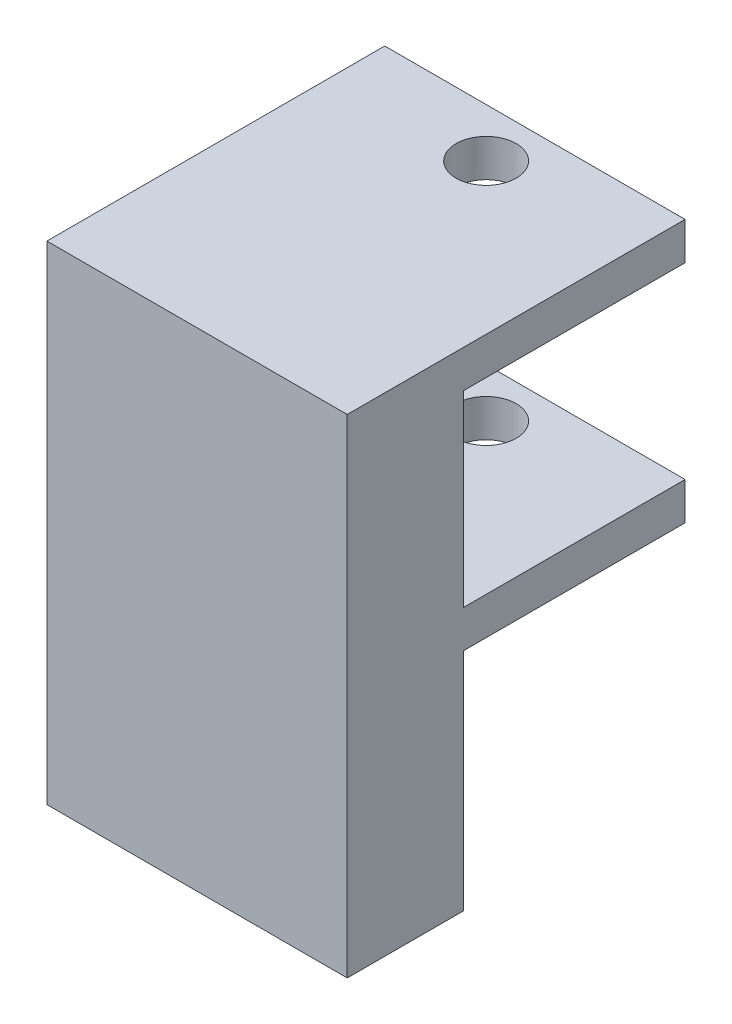
ISO-10303-21;
HEADER;
FILE_DESCRIPTION(('STEP AP214'),'2;1');
FILE_NAME('part.step','',(''),(''),'','','');
FILE_SCHEMA(('AUTOMOTIVE_DESIGN { 1 0 10303 214 1 1 1 1 }'));
ENDSEC;
DATA;
#1=APPLICATION_CONTEXT('core data for automotive mechanical design processes');
#2=APPLICATION_PROTOCOL_DEFINITION('international standard','automotive_design',2000,#1);
#3=PRODUCT_CONTEXT('',#1,'mechanical');
#4=PRODUCT('Part','Part','',(#3));
#5=PRODUCT_RELATED_PRODUCT_CATEGORY('part','',(#4));
#6=PRODUCT_DEFINITION_FORMATION('','',#4);
#7=PRODUCT_DEFINITION_CONTEXT('part definition',#1,'design');
#8=PRODUCT_DEFINITION('design','',#6,#7);
#9=PRODUCT_DEFINITION_SHAPE('','',#8);
#10=(LENGTH_UNIT() NAMED_UNIT(*) SI_UNIT(.MILLI.,.METRE.));
#11=(NAMED_UNIT(*) PLANE_ANGLE_UNIT() SI_UNIT($,.RADIAN.));
#12=(NAMED_UNIT(*) SI_UNIT($,.STERADIAN.) SOLID_ANGLE_UNIT());
#13=UNCERTAINTY_MEASURE_WITH_UNIT(LENGTH_MEASURE(1.E-05),#10,'distance_accuracy_value','');
#14=(GEOMETRIC_REPRESENTATION_CONTEXT(3) GLOBAL_UNCERTAINTY_ASSIGNED_CONTEXT((#13)) GLOBAL_UNIT_ASSIGNED_CONTEXT((#10,
#11,#12)) REPRESENTATION_CONTEXT('',''));
#15=CARTESIAN_POINT('',(0.,0.,0.));
#16=DIRECTION('',(0.,0.,1.));
#17=DIRECTION('',(1.,0.,0.));
#18=AXIS2_PLACEMENT_3D('',#15,#16,#17);
#19=CARTESIAN_POINT('',(0.,35.,0.));
#20=DIRECTION('',(0.,-1.,0.));
#21=DIRECTION('',(0.,0.,-1.));
#22=AXIS2_PLACEMENT_3D('',#19,#20,#21);
#23=PLANE('',#22);
#24=CARTESIAN_POINT('',(20.,35.,-38.5));
#25=DIRECTION('',(0.,-1.,0.));
#26=DIRECTION('',(0.,0.,-1.));
#27=AXIS2_PLACEMENT_3D('',#24,#25,#26);
#28=CIRCLE('',#27,4.);
#29=CARTESIAN_POINT('',(20.,35.,-42.5));
#30=VERTEX_POINT('',#29);
#31=EDGE_CURVE('E184',#30,#30,#28,.T.);
#32=ORIENTED_EDGE('',*,*,#31,.T.);
#33=EDGE_LOOP('',(#32));
#34=FACE_BOUND('',#33,.T.);
#35=DIRECTION('',(-1.,0.,0.));
#36=VECTOR('',#35,1.);
#37=CARTESIAN_POINT('',(0.,35.,-15.5));
#38=LINE('',#37,#36);
#39=CARTESIAN_POINT('',(40.,35.,-15.5));
#40=VERTEX_POINT('',#39);
#41=CARTESIAN_POINT('',(0.,35.,-15.5));
#42=VERTEX_POINT('',#41);
#43=EDGE_CURVE('E49',#40,#42,#38,.T.);
#44=ORIENTED_EDGE('',*,*,#43,.F.);
#45=DIRECTION('',(0.,0.,-1.));
#46=VECTOR('',#45,1.);
#47=CARTESIAN_POINT('',(40.,35.,0.));
#48=LINE('',#47,#46);
#49=CARTESIAN_POINT('',(40.,35.,-45.));
#50=VERTEX_POINT('',#49);
#51=EDGE_CURVE('E211',#40,#50,#48,.T.);
#52=ORIENTED_EDGE('',*,*,#51,.T.);
#53=DIRECTION('',(-1.,0.,0.));
#54=VECTOR('',#53,1.);
#55=CARTESIAN_POINT('',(0.,35.,-45.));
#56=LINE('',#55,#54);
#57=CARTESIAN_POINT('',(0.,35.,-45.));
#58=VERTEX_POINT('',#57);
#59=EDGE_CURVE('E214',#50,#58,#56,.T.);
#60=ORIENTED_EDGE('',*,*,#59,.T.);
#61=DIRECTION('',(0.,0.,1.));
#62=VECTOR('',#61,1.);
#63=CARTESIAN_POINT('',(0.,35.,0.));
#64=LINE('',#63,#62);
#65=EDGE_CURVE('E209',#58,#42,#64,.T.);
#66=ORIENTED_EDGE('',*,*,#65,.T.);
#67=EDGE_LOOP('',(#44,#52,#60,#66));
#68=FACE_BOUND('',#67,.T.);
#69=ADVANCED_FACE('F33',(#34,#68),#23,.F.);
#70=CARTESIAN_POINT('',(0.,30.,0.));
#71=DIRECTION('',(1.,0.,0.));
#72=DIRECTION('',(0.,0.,-1.));
#73=AXIS2_PLACEMENT_3D('',#70,#71,#72);
#74=PLANE('',#73);
#75=DIRECTION('',(0.,0.,1.));
#76=VECTOR('',#75,1.);
#77=CARTESIAN_POINT('',(0.,0.,0.));
#78=LINE('',#77,#76);
#79=CARTESIAN_POINT('',(0.,0.,-15.5));
#80=VERTEX_POINT('',#79);
#81=CARTESIAN_POINT('',(0.,0.,0.));
#82=VERTEX_POINT('',#81);
#83=EDGE_CURVE('E165',#80,#82,#78,.T.);
#84=ORIENTED_EDGE('',*,*,#83,.T.);
#85=DIRECTION('',(0.,-1.,0.));
#86=VECTOR('',#85,1.);
#87=CARTESIAN_POINT('',(0.,30.,0.));
#88=LINE('',#87,#86);
#89=CARTESIAN_POINT('',(0.,65.,0.));
#90=VERTEX_POINT('',#89);
#91=EDGE_CURVE('E11',#90,#82,#88,.T.);
#92=ORIENTED_EDGE('',*,*,#91,.F.);
#93=DIRECTION('',(0.,0.,1.));
#94=VECTOR('',#93,1.);
#95=CARTESIAN_POINT('',(0.,65.,0.));
#96=LINE('',#95,#94);
#97=CARTESIAN_POINT('',(0.,65.,-45.));
#98=VERTEX_POINT('',#97);
#99=EDGE_CURVE('E162',#98,#90,#96,.T.);
#100=ORIENTED_EDGE('',*,*,#99,.F.);
#101=DIRECTION('',(0.,-1.,0.));
#102=VECTOR('',#101,1.);
#103=CARTESIAN_POINT('',(0.,65.,-45.));
#104=LINE('',#103,#102);
#105=CARTESIAN_POINT('',(0.,60.,-45.));
#106=VERTEX_POINT('',#105);
#107=EDGE_CURVE('E189',#98,#106,#104,.T.);
#108=ORIENTED_EDGE('',*,*,#107,.T.);
#109=DIRECTION('',(0.,0.,1.));
#110=VECTOR('',#109,1.);
#111=CARTESIAN_POINT('',(0.,60.,0.));
#112=LINE('',#111,#110);
#113=CARTESIAN_POINT('',(0.,60.,-15.5));
#114=VERTEX_POINT('',#113);
#115=EDGE_CURVE('E190',#106,#114,#112,.T.);
#116=ORIENTED_EDGE('',*,*,#115,.T.);
#117=DIRECTION('',(0.,-1.,0.));
#118=VECTOR('',#117,1.);
#119=CARTESIAN_POINT('',(0.,60.,-15.5));
#120=LINE('',#119,#118);
#121=EDGE_CURVE('E201',#114,#42,#120,.T.);
#122=ORIENTED_EDGE('',*,*,#121,.T.);
#123=ORIENTED_EDGE('',*,*,#65,.F.);
#124=DIRECTION('',(0.,-1.,0.));
#125=VECTOR('',#124,1.);
#126=CARTESIAN_POINT('',(0.,35.,-45.));
#127=LINE('',#126,#125);
#128=CARTESIAN_POINT('',(0.,30.,-45.));
#129=VERTEX_POINT('',#128);
#130=EDGE_CURVE('E216',#58,#129,#127,.T.);
#131=ORIENTED_EDGE('',*,*,#130,.T.);
#132=DIRECTION('',(0.,0.,1.));
#133=VECTOR('',#132,1.);
#134=CARTESIAN_POINT('',(0.,30.,0.));
#135=LINE('',#134,#133);
#136=CARTESIAN_POINT('',(0.,30.,-15.5));
#137=VERTEX_POINT('',#136);
#138=EDGE_CURVE('E208',#129,#137,#135,.T.);
#139=ORIENTED_EDGE('',*,*,#138,.T.);
#140=DIRECTION('',(0.,-1.,0.));
#141=VECTOR('',#140,1.);
#142=CARTESIAN_POINT('',(0.,30.,-15.5));
#143=LINE('',#142,#141);
#144=EDGE_CURVE('E292',#137,#80,#143,.T.);
#145=ORIENTED_EDGE('',*,*,#144,.T.);
#146=EDGE_LOOP('',(#84,#92,#100,#108,#116,#122,#123,#131,#139,#145));
#147=FACE_BOUND('',#146,.T.);
#148=ADVANCED_FACE('F35',(#147),#74,.F.);
#149=CARTESIAN_POINT('',(0.,30.,0.));
#150=DIRECTION('',(0.,0.,-1.));
#151=DIRECTION('',(-1.,0.,0.));
#152=AXIS2_PLACEMENT_3D('',#149,#150,#151);
#153=PLANE('',#152);
#154=DIRECTION('',(1.,0.,0.));
#155=VECTOR('',#154,1.);
#156=CARTESIAN_POINT('',(0.,0.,0.));
#157=LINE('',#156,#155);
#158=CARTESIAN_POINT('',(40.,0.,0.));
#159=VERTEX_POINT('',#158);
#160=EDGE_CURVE('E295',#82,#159,#157,.T.);
#161=ORIENTED_EDGE('',*,*,#160,.T.);
#162=DIRECTION('',(0.,-1.,0.));
#163=VECTOR('',#162,1.);
#164=CARTESIAN_POINT('',(40.,30.,0.));
#165=LINE('',#164,#163);
#166=CARTESIAN_POINT('',(40.,65.,0.));
#167=VERTEX_POINT('',#166);
#168=EDGE_CURVE('E42',#167,#159,#165,.T.);
#169=ORIENTED_EDGE('',*,*,#168,.F.);
#170=DIRECTION('',(1.,0.,0.));
#171=VECTOR('',#170,1.);
#172=CARTESIAN_POINT('',(0.,65.,0.));
#173=LINE('',#172,#171);
#174=EDGE_CURVE('E168',#90,#167,#173,.T.);
#175=ORIENTED_EDGE('',*,*,#174,.F.);
#176=ORIENTED_EDGE('',*,*,#91,.T.);
#177=EDGE_LOOP('',(#161,#169,#175,#176));
#178=FACE_BOUND('',#177,.T.);
#179=ADVANCED_FACE('F169',(#178),#153,.F.);
#180=CARTESIAN_POINT('',(40.,30.,0.));
#181=DIRECTION('',(-1.,0.,0.));
#182=DIRECTION('',(0.,0.,1.));
#183=AXIS2_PLACEMENT_3D('',#180,#181,#182);
#184=PLANE('',#183);
#185=DIRECTION('',(0.,0.,-1.));
#186=VECTOR('',#185,1.);
#187=CARTESIAN_POINT('',(40.,0.,0.));
#188=LINE('',#187,#186);
#189=CARTESIAN_POINT('',(40.,0.,-15.5));
#190=VERTEX_POINT('',#189);
#191=EDGE_CURVE('E297',#159,#190,#188,.T.);
#192=ORIENTED_EDGE('',*,*,#191,.T.);
#193=DIRECTION('',(0.,-1.,0.));
#194=VECTOR('',#193,1.);
#195=CARTESIAN_POINT('',(40.,30.,-15.5));
#196=LINE('',#195,#194);
#197=CARTESIAN_POINT('',(40.,30.,-15.5));
#198=VERTEX_POINT('',#197);
#199=EDGE_CURVE('E301',#198,#190,#196,.T.);
#200=ORIENTED_EDGE('',*,*,#199,.F.);
#201=DIRECTION('',(0.,0.,-1.));
#202=VECTOR('',#201,1.);
#203=CARTESIAN_POINT('',(40.,30.,0.));
#204=LINE('',#203,#202);
#205=CARTESIAN_POINT('',(40.,30.,-45.));
#206=VERTEX_POINT('',#205);
#207=EDGE_CURVE('E219',#198,#206,#204,.T.);
#208=ORIENTED_EDGE('',*,*,#207,.T.);
#209=DIRECTION('',(0.,-1.,0.));
#210=VECTOR('',#209,1.);
#211=CARTESIAN_POINT('',(40.,35.,-45.));
#212=LINE('',#211,#210);
#213=EDGE_CURVE('E224',#50,#206,#212,.T.);
#214=ORIENTED_EDGE('',*,*,#213,.F.);
#215=ORIENTED_EDGE('',*,*,#51,.F.);
#216=DIRECTION('',(0.,-1.,0.));
#217=VECTOR('',#216,1.);
#218=CARTESIAN_POINT('',(40.,60.,-15.5));
#219=LINE('',#218,#217);
#220=CARTESIAN_POINT('',(40.,60.,-15.5));
#221=VERTEX_POINT('',#220);
#222=EDGE_CURVE('E205',#221,#40,#219,.T.);
#223=ORIENTED_EDGE('',*,*,#222,.F.);
#224=DIRECTION('',(0.,0.,-1.));
#225=VECTOR('',#224,1.);
#226=CARTESIAN_POINT('',(40.,60.,0.));
#227=LINE('',#226,#225);
#228=CARTESIAN_POINT('',(40.,60.,-45.));
#229=VERTEX_POINT('',#228);
#230=EDGE_CURVE('E181',#221,#229,#227,.T.);
#231=ORIENTED_EDGE('',*,*,#230,.T.);
#232=DIRECTION('',(0.,-1.,0.));
#233=VECTOR('',#232,1.);
#234=CARTESIAN_POINT('',(40.,65.,-45.));
#235=LINE('',#234,#233);
#236=CARTESIAN_POINT('',(40.,65.,-45.));
#237=VERTEX_POINT('',#236);
#238=EDGE_CURVE('E195',#237,#229,#235,.T.);
#239=ORIENTED_EDGE('',*,*,#238,.F.);
#240=DIRECTION('',(0.,0.,-1.));
#241=VECTOR('',#240,1.);
#242=CARTESIAN_POINT('',(40.,65.,0.));
#243=LINE('',#242,#241);
#244=EDGE_CURVE('E173',#167,#237,#243,.T.);
#245=ORIENTED_EDGE('',*,*,#244,.F.);
#246=ORIENTED_EDGE('',*,*,#168,.T.);
#247=EDGE_LOOP('',(#192,#200,#208,#214,#215,#223,#231,#239,#245,#246));
#248=FACE_BOUND('',#247,.T.);
#249=ADVANCED_FACE('F306',(#248),#184,.F.);
#250=CARTESIAN_POINT('',(0.,30.,-15.5));
#251=DIRECTION('',(0.,0.,1.));
#252=DIRECTION('',(1.,0.,0.));
#253=AXIS2_PLACEMENT_3D('',#250,#251,#252);
#254=PLANE('',#253);
#255=DIRECTION('',(-1.,0.,0.));
#256=VECTOR('',#255,1.);
#257=CARTESIAN_POINT('',(0.,0.,-15.5));
#258=LINE('',#257,#256);
#259=EDGE_CURVE('E293',#190,#80,#258,.T.);
#260=ORIENTED_EDGE('',*,*,#259,.T.);
#261=ORIENTED_EDGE('',*,*,#144,.F.);
#262=DIRECTION('',(-1.,0.,0.));
#263=VECTOR('',#262,1.);
#264=CARTESIAN_POINT('',(0.,30.,-15.5));
#265=LINE('',#264,#263);
#266=EDGE_CURVE('E289',#198,#137,#265,.T.);
#267=ORIENTED_EDGE('',*,*,#266,.F.);
#268=ORIENTED_EDGE('',*,*,#199,.T.);
#269=EDGE_LOOP('',(#260,#261,#267,#268));
#270=FACE_BOUND('',#269,.T.);
#271=ADVANCED_FACE('F312',(#270),#254,.F.);
#272=CARTESIAN_POINT('',(0.,0.,0.));
#273=DIRECTION('',(0.,-1.,0.));
#274=DIRECTION('',(0.,0.,-1.));
#275=AXIS2_PLACEMENT_3D('',#272,#273,#274);
#276=PLANE('',#275);
#277=DIRECTION('',(0.,0.,1.));
#278=VECTOR('',#277,1.);
#279=CARTESIAN_POINT('',(36.,0.,-4.));
#280=LINE('',#279,#278);
#281=CARTESIAN_POINT('',(36.,0.,-11.));
#282=VERTEX_POINT('',#281);
#283=CARTESIAN_POINT('',(36.,0.,-4.));
#284=VERTEX_POINT('',#283);
#285=EDGE_CURVE('E57',#282,#284,#280,.T.);
#286=ORIENTED_EDGE('',*,*,#285,.F.);
#287=DIRECTION('',(1.,0.,0.));
#288=VECTOR('',#287,1.);
#289=CARTESIAN_POINT('',(29.,0.,-11.));
#290=LINE('',#289,#288);
#291=CARTESIAN_POINT('',(29.,0.,-11.));
#292=VERTEX_POINT('',#291);
#293=EDGE_CURVE('E231',#292,#282,#290,.T.);
#294=ORIENTED_EDGE('',*,*,#293,.F.);
#295=DIRECTION('',(0.,0.,-1.));
#296=VECTOR('',#295,1.);
#297=CARTESIAN_POINT('',(29.,0.,-4.));
#298=LINE('',#297,#296);
#299=CARTESIAN_POINT('',(29.,0.,-4.));
#300=VERTEX_POINT('',#299);
#301=EDGE_CURVE('E245',#300,#292,#298,.T.);
#302=ORIENTED_EDGE('',*,*,#301,.F.);
#303=DIRECTION('',(-1.,0.,0.));
#304=VECTOR('',#303,1.);
#305=CARTESIAN_POINT('',(29.,0.,-4.));
#306=LINE('',#305,#304);
#307=EDGE_CURVE('E242',#284,#300,#306,.T.);
#308=ORIENTED_EDGE('',*,*,#307,.F.);
#309=EDGE_LOOP('',(#286,#294,#302,#308));
#310=FACE_BOUND('',#309,.T.);
#311=DIRECTION('',(0.,0.,1.));
#312=VECTOR('',#311,1.);
#313=CARTESIAN_POINT('',(11.,0.,-4.));
#314=LINE('',#313,#312);
#315=CARTESIAN_POINT('',(11.,0.,-11.));
#316=VERTEX_POINT('',#315);
#317=CARTESIAN_POINT('',(11.,0.,-4.));
#318=VERTEX_POINT('',#317);
#319=EDGE_CURVE('E252',#316,#318,#314,.T.);
#320=ORIENTED_EDGE('',*,*,#319,.F.);
#321=DIRECTION('',(1.,0.,0.));
#322=VECTOR('',#321,1.);
#323=CARTESIAN_POINT('',(4.,0.,-11.));
#324=LINE('',#323,#322);
#325=CARTESIAN_POINT('',(4.,0.,-11.));
#326=VERTEX_POINT('',#325);
#327=EDGE_CURVE('E262',#326,#316,#324,.T.);
#328=ORIENTED_EDGE('',*,*,#327,.F.);
#329=DIRECTION('',(0.,0.,-1.));
#330=VECTOR('',#329,1.);
#331=CARTESIAN_POINT('',(4.,0.,-4.));
#332=LINE('',#331,#330);
#333=CARTESIAN_POINT('',(4.,0.,-4.));
#334=VERTEX_POINT('',#333);
#335=EDGE_CURVE('E276',#334,#326,#332,.T.);
#336=ORIENTED_EDGE('',*,*,#335,.F.);
#337=DIRECTION('',(-1.,0.,0.));
#338=VECTOR('',#337,1.);
#339=CARTESIAN_POINT('',(4.,0.,-4.));
#340=LINE('',#339,#338);
#341=EDGE_CURVE('E273',#318,#334,#340,.T.);
#342=ORIENTED_EDGE('',*,*,#341,.F.);
#343=EDGE_LOOP('',(#320,#328,#336,#342));
#344=FACE_BOUND('',#343,.T.);
#345=ORIENTED_EDGE('',*,*,#83,.F.);
#346=ORIENTED_EDGE('',*,*,#259,.F.);
#347=ORIENTED_EDGE('',*,*,#191,.F.);
#348=ORIENTED_EDGE('',*,*,#160,.F.);
#349=EDGE_LOOP('',(#345,#346,#347,#348));
#350=FACE_BOUND('',#349,.T.);
#351=ADVANCED_FACE('F310',(#310,#344,#350),#276,.T.);
#352=CARTESIAN_POINT('',(11.,12.,-4.));
#353=DIRECTION('',(1.,0.,0.));
#354=DIRECTION('',(0.,0.,-1.));
#355=AXIS2_PLACEMENT_3D('',#352,#353,#354);
#356=PLANE('',#355);
#357=ORIENTED_EDGE('',*,*,#319,.T.);
#358=DIRECTION('',(0.,-1.,0.));
#359=VECTOR('',#358,1.);
#360=CARTESIAN_POINT('',(11.,12.,-4.));
#361=LINE('',#360,#359);
#362=CARTESIAN_POINT('',(11.,12.,-4.));
#363=VERTEX_POINT('',#362);
#364=EDGE_CURVE('E271',#363,#318,#361,.T.);
#365=ORIENTED_EDGE('',*,*,#364,.F.);
#366=DIRECTION('',(0.,0.,1.));
#367=VECTOR('',#366,1.);
#368=CARTESIAN_POINT('',(11.,12.,-4.));
#369=LINE('',#368,#367);
#370=CARTESIAN_POINT('',(11.,12.,-11.));
#371=VERTEX_POINT('',#370);
#372=EDGE_CURVE('E258',#371,#363,#369,.T.);
#373=ORIENTED_EDGE('',*,*,#372,.F.);
#374=DIRECTION('',(0.,-1.,0.));
#375=VECTOR('',#374,1.);
#376=CARTESIAN_POINT('',(11.,12.,-11.));
#377=LINE('',#376,#375);
#378=EDGE_CURVE('E281',#371,#316,#377,.T.);
#379=ORIENTED_EDGE('',*,*,#378,.T.);
#380=EDGE_LOOP('',(#357,#365,#373,#379));
#381=FACE_BOUND('',#380,.T.);
#382=ADVANCED_FACE('F387',(#381),#356,.F.);
#383=CARTESIAN_POINT('',(4.,12.,-11.));
#384=DIRECTION('',(0.,0.,-1.));
#385=DIRECTION('',(-1.,0.,0.));
#386=AXIS2_PLACEMENT_3D('',#383,#384,#385);
#387=PLANE('',#386);
#388=ORIENTED_EDGE('',*,*,#327,.T.);
#389=ORIENTED_EDGE('',*,*,#378,.F.);
#390=DIRECTION('',(1.,0.,0.));
#391=VECTOR('',#390,1.);
#392=CARTESIAN_POINT('',(4.,12.,-11.));
#393=LINE('',#392,#391);
#394=CARTESIAN_POINT('',(4.,12.,-11.));
#395=VERTEX_POINT('',#394);
#396=EDGE_CURVE('E268',#395,#371,#393,.T.);
#397=ORIENTED_EDGE('',*,*,#396,.F.);
#398=DIRECTION('',(0.,-1.,0.));
#399=VECTOR('',#398,1.);
#400=CARTESIAN_POINT('',(4.,12.,-11.));
#401=LINE('',#400,#399);
#402=EDGE_CURVE('E283',#395,#326,#401,.T.);
#403=ORIENTED_EDGE('',*,*,#402,.T.);
#404=EDGE_LOOP('',(#388,#389,#397,#403));
#405=FACE_BOUND('',#404,.T.);
#406=ADVANCED_FACE('F383',(#405),#387,.F.);
#407=CARTESIAN_POINT('',(4.,12.,-4.));
#408=DIRECTION('',(-1.,0.,0.));
#409=DIRECTION('',(0.,0.,1.));
#410=AXIS2_PLACEMENT_3D('',#407,#408,#409);
#411=PLANE('',#410);
#412=ORIENTED_EDGE('',*,*,#335,.T.);
#413=ORIENTED_EDGE('',*,*,#402,.F.);
#414=DIRECTION('',(0.,0.,-1.));
#415=VECTOR('',#414,1.);
#416=CARTESIAN_POINT('',(4.,12.,-4.));
#417=LINE('',#416,#415);
#418=CARTESIAN_POINT('',(4.,12.,-4.));
#419=VERTEX_POINT('',#418);
#420=EDGE_CURVE('E265',#419,#395,#417,.T.);
#421=ORIENTED_EDGE('',*,*,#420,.F.);
#422=DIRECTION('',(0.,-1.,0.));
#423=VECTOR('',#422,1.);
#424=CARTESIAN_POINT('',(4.,12.,-4.));
#425=LINE('',#424,#423);
#426=EDGE_CURVE('E285',#419,#334,#425,.T.);
#427=ORIENTED_EDGE('',*,*,#426,.T.);
#428=EDGE_LOOP('',(#412,#413,#421,#427));
#429=FACE_BOUND('',#428,.T.);
#430=ADVANCED_FACE('F386',(#429),#411,.F.);
#431=CARTESIAN_POINT('',(4.,12.,-4.));
#432=DIRECTION('',(0.,0.,1.));
#433=DIRECTION('',(1.,0.,0.));
#434=AXIS2_PLACEMENT_3D('',#431,#432,#433);
#435=PLANE('',#434);
#436=ORIENTED_EDGE('',*,*,#341,.T.);
#437=ORIENTED_EDGE('',*,*,#426,.F.);
#438=DIRECTION('',(-1.,0.,0.));
#439=VECTOR('',#438,1.);
#440=CARTESIAN_POINT('',(4.,12.,-4.));
#441=LINE('',#440,#439);
#442=EDGE_CURVE('E261',#363,#419,#441,.T.);
#443=ORIENTED_EDGE('',*,*,#442,.F.);
#444=ORIENTED_EDGE('',*,*,#364,.T.);
#445=EDGE_LOOP('',(#436,#437,#443,#444));
#446=FACE_BOUND('',#445,.T.);
#447=ADVANCED_FACE('F381',(#446),#435,.F.);
#448=CARTESIAN_POINT('',(0.,12.,0.));
#449=DIRECTION('',(0.,-1.,0.));
#450=DIRECTION('',(0.,0.,-1.));
#451=AXIS2_PLACEMENT_3D('',#448,#449,#450);
#452=PLANE('',#451);
#453=ORIENTED_EDGE('',*,*,#372,.T.);
#454=ORIENTED_EDGE('',*,*,#442,.T.);
#455=ORIENTED_EDGE('',*,*,#420,.T.);
#456=ORIENTED_EDGE('',*,*,#396,.T.);
#457=EDGE_LOOP('',(#453,#454,#455,#456));
#458=FACE_BOUND('',#457,.T.);
#459=ADVANCED_FACE('F378',(#458),#452,.T.);
#460=CARTESIAN_POINT('',(36.,12.,-4.));
#461=DIRECTION('',(1.,0.,0.));
#462=DIRECTION('',(0.,0.,-1.));
#463=AXIS2_PLACEMENT_3D('',#460,#461,#462);
#464=PLANE('',#463);
#465=ORIENTED_EDGE('',*,*,#285,.T.);
#466=DIRECTION('',(0.,-1.,0.));
#467=VECTOR('',#466,1.);
#468=CARTESIAN_POINT('',(36.,12.,-4.));
#469=LINE('',#468,#467);
#470=CARTESIAN_POINT('',(36.,12.,-4.));
#471=VERTEX_POINT('',#470);
#472=EDGE_CURVE('E240',#471,#284,#469,.T.);
#473=ORIENTED_EDGE('',*,*,#472,.F.);
#474=DIRECTION('',(0.,0.,1.));
#475=VECTOR('',#474,1.);
#476=CARTESIAN_POINT('',(36.,12.,-4.));
#477=LINE('',#476,#475);
#478=CARTESIAN_POINT('',(36.,12.,-11.));
#479=VERTEX_POINT('',#478);
#480=EDGE_CURVE('E227',#479,#471,#477,.T.);
#481=ORIENTED_EDGE('',*,*,#480,.F.);
#482=DIRECTION('',(0.,-1.,0.));
#483=VECTOR('',#482,1.);
#484=CARTESIAN_POINT('',(36.,12.,-11.));
#485=LINE('',#484,#483);
#486=EDGE_CURVE('E250',#479,#282,#485,.T.);
#487=ORIENTED_EDGE('',*,*,#486,.T.);
#488=EDGE_LOOP('',(#465,#473,#481,#487));
#489=FACE_BOUND('',#488,.T.);
#490=ADVANCED_FACE('F368',(#489),#464,.F.);
#491=CARTESIAN_POINT('',(29.,12.,-11.));
#492=DIRECTION('',(0.,0.,-1.));
#493=DIRECTION('',(-1.,0.,0.));
#494=AXIS2_PLACEMENT_3D('',#491,#492,#493);
#495=PLANE('',#494);
#496=ORIENTED_EDGE('',*,*,#293,.T.);
#497=ORIENTED_EDGE('',*,*,#486,.F.);
#498=DIRECTION('',(1.,0.,0.));
#499=VECTOR('',#498,1.);
#500=CARTESIAN_POINT('',(29.,12.,-11.));
#501=LINE('',#500,#499);
#502=CARTESIAN_POINT('',(29.,12.,-11.));
#503=VERTEX_POINT('',#502);
#504=EDGE_CURVE('E237',#503,#479,#501,.T.);
#505=ORIENTED_EDGE('',*,*,#504,.F.);
#506=DIRECTION('',(0.,-1.,0.));
#507=VECTOR('',#506,1.);
#508=CARTESIAN_POINT('',(29.,12.,-11.));
#509=LINE('',#508,#507);
#510=EDGE_CURVE('E253',#503,#292,#509,.T.);
#511=ORIENTED_EDGE('',*,*,#510,.T.);
#512=EDGE_LOOP('',(#496,#497,#505,#511));
#513=FACE_BOUND('',#512,.T.);
#514=ADVANCED_FACE('F364',(#513),#495,.F.);
#515=CARTESIAN_POINT('',(29.,12.,-4.));
#516=DIRECTION('',(-1.,0.,0.));
#517=DIRECTION('',(0.,0.,1.));
#518=AXIS2_PLACEMENT_3D('',#515,#516,#517);
#519=PLANE('',#518);
#520=ORIENTED_EDGE('',*,*,#301,.T.);
#521=ORIENTED_EDGE('',*,*,#510,.F.);
#522=DIRECTION('',(0.,0.,-1.));
#523=VECTOR('',#522,1.);
#524=CARTESIAN_POINT('',(29.,12.,-4.));
#525=LINE('',#524,#523);
#526=CARTESIAN_POINT('',(29.,12.,-4.));
#527=VERTEX_POINT('',#526);
#528=EDGE_CURVE('E234',#527,#503,#525,.T.);
#529=ORIENTED_EDGE('',*,*,#528,.F.);
#530=DIRECTION('',(0.,-1.,0.));
#531=VECTOR('',#530,1.);
#532=CARTESIAN_POINT('',(29.,12.,-4.));
#533=LINE('',#532,#531);
#534=EDGE_CURVE('E255',#527,#300,#533,.T.);
#535=ORIENTED_EDGE('',*,*,#534,.T.);
#536=EDGE_LOOP('',(#520,#521,#529,#535));
#537=FACE_BOUND('',#536,.T.);
#538=ADVANCED_FACE('F367',(#537),#519,.F.);
#539=CARTESIAN_POINT('',(29.,12.,-4.));
#540=DIRECTION('',(0.,0.,1.));
#541=DIRECTION('',(1.,0.,0.));
#542=AXIS2_PLACEMENT_3D('',#539,#540,#541);
#543=PLANE('',#542);
#544=ORIENTED_EDGE('',*,*,#307,.T.);
#545=ORIENTED_EDGE('',*,*,#534,.F.);
#546=DIRECTION('',(-1.,0.,0.));
#547=VECTOR('',#546,1.);
#548=CARTESIAN_POINT('',(29.,12.,-4.));
#549=LINE('',#548,#547);
#550=EDGE_CURVE('E230',#471,#527,#549,.T.);
#551=ORIENTED_EDGE('',*,*,#550,.F.);
#552=ORIENTED_EDGE('',*,*,#472,.T.);
#553=EDGE_LOOP('',(#544,#545,#551,#552));
#554=FACE_BOUND('',#553,.T.);
#555=ADVANCED_FACE('F362',(#554),#543,.F.);
#556=CARTESIAN_POINT('',(0.,12.,0.));
#557=DIRECTION('',(0.,-1.,0.));
#558=DIRECTION('',(0.,0.,-1.));
#559=AXIS2_PLACEMENT_3D('',#556,#557,#558);
#560=PLANE('',#559);
#561=ORIENTED_EDGE('',*,*,#480,.T.);
#562=ORIENTED_EDGE('',*,*,#550,.T.);
#563=ORIENTED_EDGE('',*,*,#528,.T.);
#564=ORIENTED_EDGE('',*,*,#504,.T.);
#565=EDGE_LOOP('',(#561,#562,#563,#564));
#566=FACE_BOUND('',#565,.T.);
#567=ADVANCED_FACE('F359',(#566),#560,.T.);
#568=CARTESIAN_POINT('',(0.,35.,-45.));
#569=DIRECTION('',(0.,0.,1.));
#570=DIRECTION('',(1.,0.,0.));
#571=AXIS2_PLACEMENT_3D('',#568,#569,#570);
#572=PLANE('',#571);
#573=DIRECTION('',(-1.,0.,0.));
#574=VECTOR('',#573,1.);
#575=CARTESIAN_POINT('',(0.,30.,-45.));
#576=LINE('',#575,#574);
#577=EDGE_CURVE('E212',#206,#129,#576,.T.);
#578=ORIENTED_EDGE('',*,*,#577,.T.);
#579=ORIENTED_EDGE('',*,*,#130,.F.);
#580=ORIENTED_EDGE('',*,*,#59,.F.);
#581=ORIENTED_EDGE('',*,*,#213,.T.);
#582=EDGE_LOOP('',(#578,#579,#580,#581));
#583=FACE_BOUND('',#582,.T.);
#584=ADVANCED_FACE('F324',(#583),#572,.F.);
#585=CARTESIAN_POINT('',(0.,30.,0.));
#586=DIRECTION('',(0.,-1.,0.));
#587=DIRECTION('',(0.,0.,-1.));
#588=AXIS2_PLACEMENT_3D('',#585,#586,#587);
#589=PLANE('',#588);
#590=CARTESIAN_POINT('',(20.,30.,-38.5));
#591=DIRECTION('',(0.,-1.,0.));
#592=DIRECTION('',(0.,0.,-1.));
#593=AXIS2_PLACEMENT_3D('',#590,#591,#592);
#594=CIRCLE('',#593,4.);
#595=CARTESIAN_POINT('',(20.,30.,-42.5));
#596=VERTEX_POINT('',#595);
#597=EDGE_CURVE('E473',#596,#596,#594,.T.);
#598=ORIENTED_EDGE('',*,*,#597,.F.);
#599=EDGE_LOOP('',(#598));
#600=FACE_BOUND('',#599,.T.);
#601=ORIENTED_EDGE('',*,*,#207,.F.);
#602=ORIENTED_EDGE('',*,*,#266,.T.);
#603=ORIENTED_EDGE('',*,*,#138,.F.);
#604=ORIENTED_EDGE('',*,*,#577,.F.);
#605=EDGE_LOOP('',(#601,#602,#603,#604));
#606=FACE_BOUND('',#605,.T.);
#607=ADVANCED_FACE('F320',(#600,#606),#589,.T.);
#608=CARTESIAN_POINT('',(0.,60.,-15.5));
#609=DIRECTION('',(0.,0.,1.));
#610=DIRECTION('',(1.,0.,0.));
#611=AXIS2_PLACEMENT_3D('',#608,#609,#610);
#612=PLANE('',#611);
#613=ORIENTED_EDGE('',*,*,#43,.T.);
#614=ORIENTED_EDGE('',*,*,#121,.F.);
#615=DIRECTION('',(-1.,0.,0.));
#616=VECTOR('',#615,1.);
#617=CARTESIAN_POINT('',(0.,60.,-15.5));
#618=LINE('',#617,#616);
#619=EDGE_CURVE('E198',#221,#114,#618,.T.);
#620=ORIENTED_EDGE('',*,*,#619,.F.);
#621=ORIENTED_EDGE('',*,*,#222,.T.);
#622=EDGE_LOOP('',(#613,#614,#620,#621));
#623=FACE_BOUND('',#622,.T.);
#624=ADVANCED_FACE('F327',(#623),#612,.F.);
#625=CARTESIAN_POINT('',(0.,65.,-45.));
#626=DIRECTION('',(0.,0.,1.));
#627=DIRECTION('',(1.,0.,0.));
#628=AXIS2_PLACEMENT_3D('',#625,#626,#627);
#629=PLANE('',#628);
#630=DIRECTION('',(-1.,0.,0.));
#631=VECTOR('',#630,1.);
#632=CARTESIAN_POINT('',(0.,60.,-45.));
#633=LINE('',#632,#631);
#634=EDGE_CURVE('E179',#229,#106,#633,.T.);
#635=ORIENTED_EDGE('',*,*,#634,.T.);
#636=ORIENTED_EDGE('',*,*,#107,.F.);
#637=DIRECTION('',(-1.,0.,0.));
#638=VECTOR('',#637,1.);
#639=CARTESIAN_POINT('',(0.,65.,-45.));
#640=LINE('',#639,#638);
#641=EDGE_CURVE('E177',#237,#98,#640,.T.);
#642=ORIENTED_EDGE('',*,*,#641,.F.);
#643=ORIENTED_EDGE('',*,*,#238,.T.);
#644=EDGE_LOOP('',(#635,#636,#642,#643));
#645=FACE_BOUND('',#644,.T.);
#646=ADVANCED_FACE('F334',(#645),#629,.F.);
#647=CARTESIAN_POINT('',(0.,65.,0.));
#648=DIRECTION('',(0.,-1.,0.));
#649=DIRECTION('',(0.,0.,-1.));
#650=AXIS2_PLACEMENT_3D('',#647,#648,#649);
#651=PLANE('',#650);
#652=CARTESIAN_POINT('',(20.,65.,-38.5));
#653=DIRECTION('',(0.,1.,0.));
#654=DIRECTION('',(0.,0.,1.));
#655=AXIS2_PLACEMENT_3D('',#652,#653,#654);
#656=CIRCLE('',#655,4.);
#657=CARTESIAN_POINT('',(20.,65.,-34.5));
#658=VERTEX_POINT('',#657);
#659=EDGE_CURVE('E476',#658,#658,#656,.T.);
#660=ORIENTED_EDGE('',*,*,#659,.F.);
#661=EDGE_LOOP('',(#660));
#662=FACE_BOUND('',#661,.T.);
#663=ORIENTED_EDGE('',*,*,#99,.T.);
#664=ORIENTED_EDGE('',*,*,#174,.T.);
#665=ORIENTED_EDGE('',*,*,#244,.T.);
#666=ORIENTED_EDGE('',*,*,#641,.T.);
#667=EDGE_LOOP('',(#663,#664,#665,#666));
#668=FACE_BOUND('',#667,.T.);
#669=ADVANCED_FACE('F175',(#662,#668),#651,.F.);
#670=CARTESIAN_POINT('',(0.,60.,0.));
#671=DIRECTION('',(0.,-1.,0.));
#672=DIRECTION('',(0.,0.,-1.));
#673=AXIS2_PLACEMENT_3D('',#670,#671,#672);
#674=PLANE('',#673);
#675=CARTESIAN_POINT('',(20.,60.,-38.5));
#676=DIRECTION('',(0.,-1.,0.));
#677=DIRECTION('',(0.,0.,-1.));
#678=AXIS2_PLACEMENT_3D('',#675,#676,#677);
#679=CIRCLE('',#678,4.);
#680=CARTESIAN_POINT('',(20.,60.,-42.5));
#681=VERTEX_POINT('',#680);
#682=EDGE_CURVE('E37',#681,#681,#679,.T.);
#683=ORIENTED_EDGE('',*,*,#682,.F.);
#684=EDGE_LOOP('',(#683));
#685=FACE_BOUND('',#684,.T.);
#686=ORIENTED_EDGE('',*,*,#230,.F.);
#687=ORIENTED_EDGE('',*,*,#619,.T.);
#688=ORIENTED_EDGE('',*,*,#115,.F.);
#689=ORIENTED_EDGE('',*,*,#634,.F.);
#690=EDGE_LOOP('',(#686,#687,#688,#689));
#691=FACE_BOUND('',#690,.T.);
#692=ADVANCED_FACE('F332',(#685,#691),#674,.T.);
#693=CARTESIAN_POINT('',(20.,0.,-38.5));
#694=DIRECTION('',(0.,1.,0.));
#695=DIRECTION('',(0.,0.,1.));
#696=AXIS2_PLACEMENT_3D('',#693,#694,#695);
#697=CYLINDRICAL_SURFACE('',#696,4.);
#698=ORIENTED_EDGE('',*,*,#682,.T.);
#699=EDGE_LOOP('',(#698));
#700=FACE_BOUND('',#699,.T.);
#701=ORIENTED_EDGE('',*,*,#659,.T.);
#702=EDGE_LOOP('',(#701));
#703=FACE_BOUND('',#702,.T.);
#704=ADVANCED_FACE('F450',(#700,#703),#697,.F.);
#705=ORIENTED_EDGE('',*,*,#597,.T.);
#706=EDGE_LOOP('',(#705));
#707=FACE_BOUND('',#706,.T.);
#708=ORIENTED_EDGE('',*,*,#31,.F.);
#709=EDGE_LOOP('',(#708));
#710=FACE_BOUND('',#709,.T.);
#711=ADVANCED_FACE('F458',(#707,#710),#697,.F.);
#712=CLOSED_SHELL('',(#69,#148,#179,#249,#271,#351,#382,#406,#430,#447,#459,#490,#514,#538,#555,
#567,#584,#607,#624,#646,#669,#692,#704,#711));
#713=MANIFOLD_SOLID_BREP('B2',#712);
#714=ADVANCED_BREP_SHAPE_REPRESENTATION('',(#18,#713),#14);
#715=SHAPE_DEFINITION_REPRESENTATION(#9,#714);
ENDSEC;
END-ISO-10303-21;
